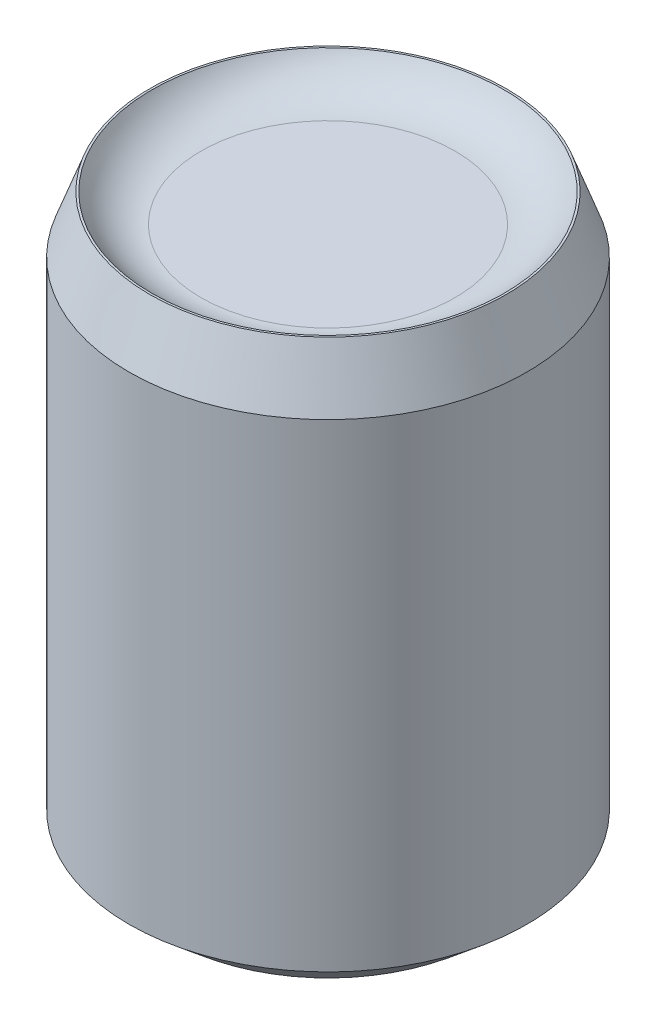
ISO-10303-21;
HEADER;
FILE_DESCRIPTION(('STEP AP214'),'2;1');
FILE_NAME('part.step','',(''),(''),'','','');
FILE_SCHEMA(('AUTOMOTIVE_DESIGN { 1 0 10303 214 1 1 1 1 }'));
ENDSEC;
DATA;
#1=APPLICATION_CONTEXT('core data for automotive mechanical design processes');
#2=APPLICATION_PROTOCOL_DEFINITION('international standard','automotive_design',2000,#1);
#3=PRODUCT_CONTEXT('',#1,'mechanical');
#4=PRODUCT('Part','Part','',(#3));
#5=PRODUCT_RELATED_PRODUCT_CATEGORY('part','',(#4));
#6=PRODUCT_DEFINITION_FORMATION('','',#4);
#7=PRODUCT_DEFINITION_CONTEXT('part definition',#1,'design');
#8=PRODUCT_DEFINITION('design','',#6,#7);
#9=PRODUCT_DEFINITION_SHAPE('','',#8);
#10=(LENGTH_UNIT() NAMED_UNIT(*) SI_UNIT(.MILLI.,.METRE.));
#11=(NAMED_UNIT(*) PLANE_ANGLE_UNIT() SI_UNIT($,.RADIAN.));
#12=(NAMED_UNIT(*) SI_UNIT($,.STERADIAN.) SOLID_ANGLE_UNIT());
#13=UNCERTAINTY_MEASURE_WITH_UNIT(LENGTH_MEASURE(1.E-05),#10,'distance_accuracy_value','');
#14=(GEOMETRIC_REPRESENTATION_CONTEXT(3) GLOBAL_UNCERTAINTY_ASSIGNED_CONTEXT((#13)) GLOBAL_UNIT_ASSIGNED_CONTEXT((#10,
#11,#12)) REPRESENTATION_CONTEXT('',''));
#15=CARTESIAN_POINT('',(0.,0.,0.));
#16=DIRECTION('',(0.,0.,1.));
#17=DIRECTION('',(1.,0.,0.));
#18=AXIS2_PLACEMENT_3D('',#15,#16,#17);
#19=CARTESIAN_POINT('',(0.,100.,0.));
#20=DIRECTION('',(0.,-1.,0.));
#21=DIRECTION('',(0.,0.,-1.));
#22=AXIS2_PLACEMENT_3D('',#19,#20,#21);
#23=CYLINDRICAL_SURFACE('',#22,35.);
#24=CARTESIAN_POINT('',(0.,5.87369741824093,0.));
#25=DIRECTION('',(0.,1.,0.));
#26=DIRECTION('',(0.,0.,1.));
#27=AXIS2_PLACEMENT_3D('',#24,#25,#26);
#28=CIRCLE('',#27,35.);
#29=CARTESIAN_POINT('',(0.,5.87369741824093,35.));
#30=VERTEX_POINT('',#29);
#31=EDGE_CURVE('E43',#30,#30,#28,.T.);
#32=ORIENTED_EDGE('',*,*,#31,.T.);
#33=EDGE_LOOP('',(#32));
#34=FACE_BOUND('',#33,.T.);
#35=CARTESIAN_POINT('',(0.,89.9999999999999,0.));
#36=DIRECTION('',(0.,1.,0.));
#37=DIRECTION('',(0.,0.,1.));
#38=AXIS2_PLACEMENT_3D('',#35,#36,#37);
#39=CIRCLE('',#38,35.);
#40=CARTESIAN_POINT('',(0.,89.9999999999999,35.));
#41=VERTEX_POINT('',#40);
#42=EDGE_CURVE('E47',#41,#41,#39,.F.);
#43=ORIENTED_EDGE('',*,*,#42,.T.);
#44=EDGE_LOOP('',(#43));
#45=FACE_BOUND('',#44,.T.);
#46=ADVANCED_FACE('F32',(#34,#45),#23,.T.);
#47=CARTESIAN_POINT('',(0.,100.,0.));
#48=DIRECTION('',(0.,1.,0.));
#49=DIRECTION('',(0.,0.,1.));
#50=AXIS2_PLACEMENT_3D('',#47,#48,#49);
#51=PLANE('',#50);
#52=CARTESIAN_POINT('',(0.,100.,0.));
#53=DIRECTION('',(0.,1.,0.));
#54=DIRECTION('',(0.,0.,1.));
#55=AXIS2_PLACEMENT_3D('',#52,#53,#54);
#56=CIRCLE('',#55,31.);
#57=CARTESIAN_POINT('',(0.,100.,31.));
#58=VERTEX_POINT('',#57);
#59=EDGE_CURVE('E55',#58,#58,#56,.T.);
#60=ORIENTED_EDGE('',*,*,#59,.F.);
#61=EDGE_LOOP('',(#60));
#62=FACE_BOUND('',#61,.T.);
#63=CARTESIAN_POINT('',(0.,100.,0.));
#64=DIRECTION('',(0.,1.,0.));
#65=DIRECTION('',(0.,0.,1.));
#66=AXIS2_PLACEMENT_3D('',#63,#64,#65);
#67=CIRCLE('',#66,31.360297657338);
#68=CARTESIAN_POINT('',(0.,100.,31.360297657338));
#69=VERTEX_POINT('',#68);
#70=EDGE_CURVE('E52',#69,#69,#67,.T.);
#71=ORIENTED_EDGE('',*,*,#70,.T.);
#72=EDGE_LOOP('',(#71));
#73=FACE_BOUND('',#72,.T.);
#74=ADVANCED_FACE('F61',(#62,#73),#51,.T.);
#75=CARTESIAN_POINT('',(0.,0.,0.));
#76=DIRECTION('',(0.,1.,0.));
#77=DIRECTION('',(0.,0.,1.));
#78=AXIS2_PLACEMENT_3D('',#75,#76,#77);
#79=PLANE('',#78);
#80=CARTESIAN_POINT('',(0.,0.,0.));
#81=DIRECTION('',(0.,1.,0.));
#82=DIRECTION('',(0.,0.,1.));
#83=AXIS2_PLACEMENT_3D('',#80,#81,#82);
#84=CIRCLE('',#83,28.);
#85=CARTESIAN_POINT('',(0.,0.,28.));
#86=VERTEX_POINT('',#85);
#87=EDGE_CURVE('E39',#86,#86,#84,.F.);
#88=ORIENTED_EDGE('',*,*,#87,.T.);
#89=EDGE_LOOP('',(#88));
#90=FACE_BOUND('',#89,.T.);
#91=ADVANCED_FACE('F64',(#90),#79,.F.);
#92=CARTESIAN_POINT('',(0.,100.,0.));
#93=DIRECTION('',(0.,-1.,0.));
#94=DIRECTION('',(0.,0.,-1.));
#95=AXIS2_PLACEMENT_3D('',#92,#93,#94);
#96=CONICAL_SURFACE('',#95,31.360297657338,0.349065850398863);
#97=ORIENTED_EDGE('',*,*,#42,.F.);
#98=EDGE_LOOP('',(#97));
#99=FACE_BOUND('',#98,.T.);
#100=ORIENTED_EDGE('',*,*,#70,.F.);
#101=EDGE_LOOP('',(#100));
#102=FACE_BOUND('',#101,.T.);
#103=ADVANCED_FACE('F68',(#99,#102),#96,.T.);
#104=CARTESIAN_POINT('',(0.,5.87369741824093,0.));
#105=DIRECTION('',(0.,1.,0.));
#106=DIRECTION('',(0.,0.,1.));
#107=AXIS2_PLACEMENT_3D('',#104,#105,#106);
#108=CONICAL_SURFACE('',#107,35.,0.872664625997168);
#109=ORIENTED_EDGE('',*,*,#87,.F.);
#110=EDGE_LOOP('',(#109));
#111=FACE_BOUND('',#110,.T.);
#112=ORIENTED_EDGE('',*,*,#31,.F.);
#113=EDGE_LOOP('',(#112));
#114=FACE_BOUND('',#113,.T.);
#115=ADVANCED_FACE('F70',(#111,#114),#108,.T.);
#116=CARTESIAN_POINT('',(0.,95.,0.));
#117=DIRECTION('',(0.,1.,0.));
#118=DIRECTION('',(0.,0.,1.));
#119=AXIS2_PLACEMENT_3D('',#116,#117,#118);
#120=PLANE('',#119);
#121=CARTESIAN_POINT('',(0.,95.,0.));
#122=DIRECTION('',(0.,1.,0.));
#123=DIRECTION('',(0.,0.,1.));
#124=AXIS2_PLACEMENT_3D('',#121,#122,#123);
#125=CIRCLE('',#124,22.3397459621556);
#126=CARTESIAN_POINT('',(0.,95.,22.3397459621556));
#127=VERTEX_POINT('',#126);
#128=EDGE_CURVE('E10',#127,#127,#125,.T.);
#129=ORIENTED_EDGE('',*,*,#128,.T.);
#130=EDGE_LOOP('',(#129));
#131=FACE_BOUND('',#130,.T.);
#132=ADVANCED_FACE('F77',(#131),#120,.T.);
#133=CARTESIAN_POINT('',(0.,105.,0.));
#134=DIRECTION('',(0.,-1.,0.));
#135=DIRECTION('',(0.,0.,-1.));
#136=AXIS2_PLACEMENT_3D('',#133,#134,#135);
#137=TOROIDAL_SURFACE('',#136,22.3397459621556,10.);
#138=ORIENTED_EDGE('',*,*,#59,.T.);
#139=EDGE_LOOP('',(#138));
#140=FACE_BOUND('',#139,.T.);
#141=ORIENTED_EDGE('',*,*,#128,.F.);
#142=EDGE_LOOP('',(#141));
#143=FACE_BOUND('',#142,.T.);
#144=ADVANCED_FACE('F34',(#140,#143),#137,.F.);
#145=CLOSED_SHELL('',(#46,#74,#91,#103,#115,#132,#144));
#146=MANIFOLD_SOLID_BREP('B2',#145);
#147=ADVANCED_BREP_SHAPE_REPRESENTATION('',(#18,#146),#14);
#148=SHAPE_DEFINITION_REPRESENTATION(#9,#147);
ENDSEC;
END-ISO-10303-21;
